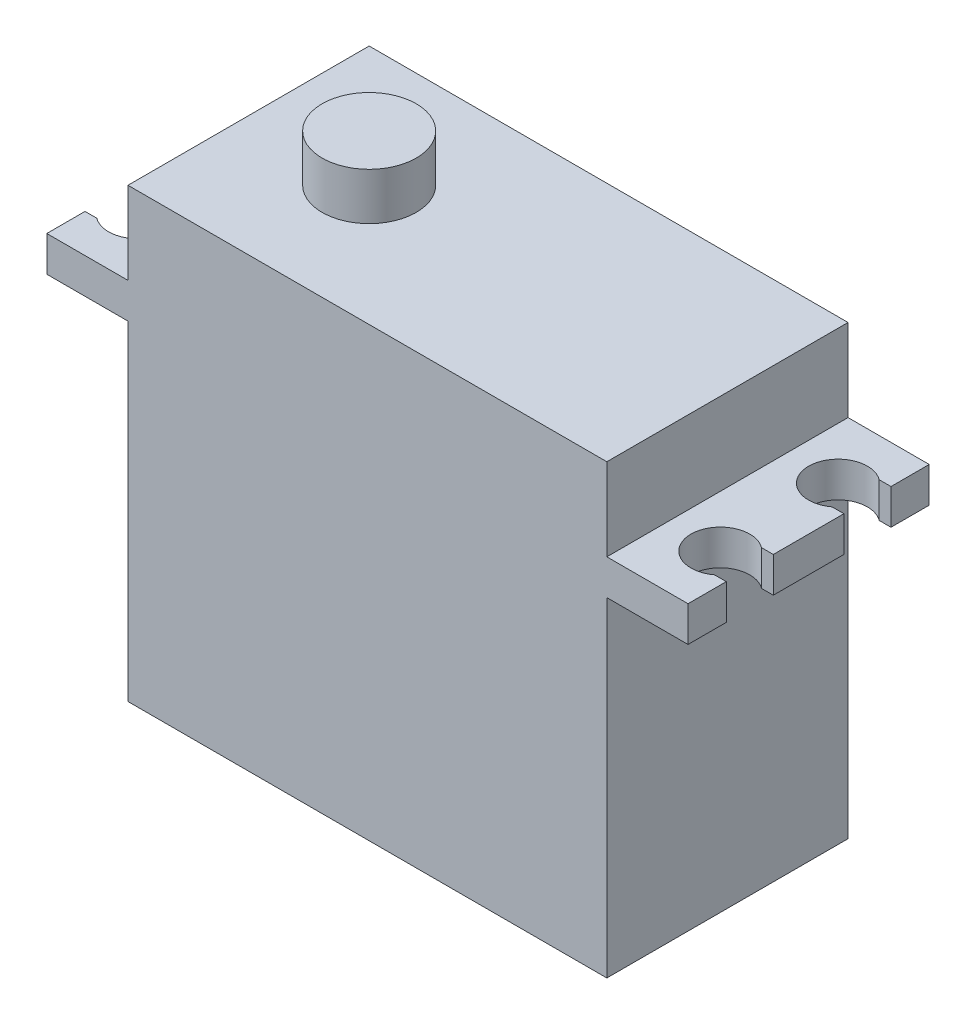
ISO-10303-21;
HEADER;
FILE_DESCRIPTION(('STEP AP214'),'2;1');
FILE_NAME('part.step','',(''),(''),'','','');
FILE_SCHEMA(('AUTOMOTIVE_DESIGN { 1 0 10303 214 1 1 1 1 }'));
ENDSEC;
DATA;
#1=APPLICATION_CONTEXT('core data for automotive mechanical design processes');
#2=APPLICATION_PROTOCOL_DEFINITION('international standard','automotive_design',2000,#1);
#3=PRODUCT_CONTEXT('',#1,'mechanical');
#4=PRODUCT('Part','Part','',(#3));
#5=PRODUCT_RELATED_PRODUCT_CATEGORY('part','',(#4));
#6=PRODUCT_DEFINITION_FORMATION('','',#4);
#7=PRODUCT_DEFINITION_CONTEXT('part definition',#1,'design');
#8=PRODUCT_DEFINITION('design','',#6,#7);
#9=PRODUCT_DEFINITION_SHAPE('','',#8);
#10=(LENGTH_UNIT() NAMED_UNIT(*) SI_UNIT(.MILLI.,.METRE.));
#11=(NAMED_UNIT(*) PLANE_ANGLE_UNIT() SI_UNIT($,.RADIAN.));
#12=(NAMED_UNIT(*) SI_UNIT($,.STERADIAN.) SOLID_ANGLE_UNIT());
#13=UNCERTAINTY_MEASURE_WITH_UNIT(LENGTH_MEASURE(1.E-05),#10,'distance_accuracy_value','');
#14=(GEOMETRIC_REPRESENTATION_CONTEXT(3) GLOBAL_UNCERTAINTY_ASSIGNED_CONTEXT((#13)) GLOBAL_UNIT_ASSIGNED_CONTEXT((#10,
#11,#12)) REPRESENTATION_CONTEXT('',''));
#15=CARTESIAN_POINT('',(0.,0.,0.));
#16=DIRECTION('',(0.,0.,1.));
#17=DIRECTION('',(1.,0.,0.));
#18=AXIS2_PLACEMENT_3D('',#15,#16,#17);
#19=CARTESIAN_POINT('',(47.6,31.,-20.5));
#20=DIRECTION('',(-1.,0.,0.));
#21=DIRECTION('',(0.,0.,1.));
#22=AXIS2_PLACEMENT_3D('',#19,#20,#21);
#23=PLANE('',#22);
#24=DIRECTION('',(0.,0.,-1.));
#25=VECTOR('',#24,1.);
#26=CARTESIAN_POINT('',(47.6,28.,-20.5));
#27=LINE('',#26,#25);
#28=CARTESIAN_POINT('',(47.6,28.,-7.25000000000004));
#29=VERTEX_POINT('',#28);
#30=CARTESIAN_POINT('',(47.6,28.,-13.25));
#31=VERTEX_POINT('',#30);
#32=EDGE_CURVE('E236',#29,#31,#27,.T.);
#33=ORIENTED_EDGE('',*,*,#32,.T.);
#34=DIRECTION('',(0.,-1.,0.));
#35=VECTOR('',#34,1.);
#36=CARTESIAN_POINT('',(47.6,42.,-13.25));
#37=LINE('',#36,#35);
#38=CARTESIAN_POINT('',(47.6,31.,-13.25));
#39=VERTEX_POINT('',#38);
#40=EDGE_CURVE('E220',#39,#31,#37,.T.);
#41=ORIENTED_EDGE('',*,*,#40,.F.);
#42=DIRECTION('',(0.,0.,-1.));
#43=VECTOR('',#42,1.);
#44=CARTESIAN_POINT('',(47.6,31.,-20.5));
#45=LINE('',#44,#43);
#46=CARTESIAN_POINT('',(47.6,31.,-7.25000000000004));
#47=VERTEX_POINT('',#46);
#48=EDGE_CURVE('E368',#47,#39,#45,.T.);
#49=ORIENTED_EDGE('',*,*,#48,.F.);
#50=DIRECTION('',(0.,-1.,0.));
#51=VECTOR('',#50,1.);
#52=CARTESIAN_POINT('',(47.6,42.,-7.25000000000004));
#53=LINE('',#52,#51);
#54=EDGE_CURVE('E243',#47,#29,#53,.T.);
#55=ORIENTED_EDGE('',*,*,#54,.T.);
#56=EDGE_LOOP('',(#33,#41,#49,#55));
#57=FACE_BOUND('',#56,.T.);
#58=ADVANCED_FACE('F35',(#57),#23,.F.);
#59=CARTESIAN_POINT('',(47.6,31.,-17.25));
#60=VERTEX_POINT('',#59);
#61=CARTESIAN_POINT('',(47.6,31.,-20.5));
#62=VERTEX_POINT('',#61);
#63=EDGE_CURVE('E365',#60,#62,#45,.T.);
#64=ORIENTED_EDGE('',*,*,#63,.F.);
#65=DIRECTION('',(0.,-1.,0.));
#66=VECTOR('',#65,1.);
#67=CARTESIAN_POINT('',(47.6,42.,-17.25));
#68=LINE('',#67,#66);
#69=CARTESIAN_POINT('',(47.6,28.,-17.25));
#70=VERTEX_POINT('',#69);
#71=EDGE_CURVE('E229',#60,#70,#68,.T.);
#72=ORIENTED_EDGE('',*,*,#71,.T.);
#73=CARTESIAN_POINT('',(47.6,28.,-20.5));
#74=VERTEX_POINT('',#73);
#75=EDGE_CURVE('E245',#70,#74,#27,.T.);
#76=ORIENTED_EDGE('',*,*,#75,.T.);
#77=DIRECTION('',(0.,-1.,0.));
#78=VECTOR('',#77,1.);
#79=CARTESIAN_POINT('',(47.6,31.,-20.5));
#80=LINE('',#79,#78);
#81=EDGE_CURVE('E260',#62,#74,#80,.T.);
#82=ORIENTED_EDGE('',*,*,#81,.F.);
#83=EDGE_LOOP('',(#64,#72,#76,#82));
#84=FACE_BOUND('',#83,.T.);
#85=ADVANCED_FACE('F460',(#84),#23,.F.);
#86=DIRECTION('',(0.,-1.,0.));
#87=VECTOR('',#86,1.);
#88=CARTESIAN_POINT('',(47.6,42.,-3.25000000000004));
#89=LINE('',#88,#87);
#90=CARTESIAN_POINT('',(47.6,31.,-3.25000000000004));
#91=VERTEX_POINT('',#90);
#92=CARTESIAN_POINT('',(47.6,28.,-3.25000000000004));
#93=VERTEX_POINT('',#92);
#94=EDGE_CURVE('E58',#91,#93,#89,.T.);
#95=ORIENTED_EDGE('',*,*,#94,.F.);
#96=CARTESIAN_POINT('',(47.6,31.,0.));
#97=VERTEX_POINT('',#96);
#98=EDGE_CURVE('E370',#97,#91,#45,.T.);
#99=ORIENTED_EDGE('',*,*,#98,.F.);
#100=DIRECTION('',(0.,-1.,0.));
#101=VECTOR('',#100,1.);
#102=CARTESIAN_POINT('',(47.6,31.,0.));
#103=LINE('',#102,#101);
#104=CARTESIAN_POINT('',(47.6,28.,0.));
#105=VERTEX_POINT('',#104);
#106=EDGE_CURVE('E264',#97,#105,#103,.T.);
#107=ORIENTED_EDGE('',*,*,#106,.T.);
#108=EDGE_CURVE('E244',#105,#93,#27,.T.);
#109=ORIENTED_EDGE('',*,*,#108,.T.);
#110=EDGE_LOOP('',(#95,#99,#107,#109));
#111=FACE_BOUND('',#110,.T.);
#112=ADVANCED_FACE('F462',(#111),#23,.F.);
#113=CARTESIAN_POINT('',(0.,31.,0.));
#114=DIRECTION('',(0.,1.,0.));
#115=DIRECTION('',(0.,0.,1.));
#116=AXIS2_PLACEMENT_3D('',#113,#114,#115);
#117=PLANE('',#116);
#118=DIRECTION('',(1.,0.,0.));
#119=VECTOR('',#118,1.);
#120=CARTESIAN_POINT('',(0.,31.,-13.25));
#121=LINE('',#120,#119);
#122=CARTESIAN_POINT('',(46.6,31.,-13.25));
#123=VERTEX_POINT('',#122);
#124=EDGE_CURVE('E223',#123,#39,#121,.T.);
#125=ORIENTED_EDGE('',*,*,#124,.F.);
#126=CARTESIAN_POINT('',(45.1,31.,-15.25));
#127=DIRECTION('',(0.,1.,0.));
#128=DIRECTION('',(0.,0.,1.));
#129=AXIS2_PLACEMENT_3D('',#126,#127,#128);
#130=CIRCLE('',#129,2.5);
#131=CARTESIAN_POINT('',(46.6,31.,-17.25));
#132=VERTEX_POINT('',#131);
#133=EDGE_CURVE('E228',#132,#123,#130,.T.);
#134=ORIENTED_EDGE('',*,*,#133,.F.);
#135=DIRECTION('',(-1.,0.,0.));
#136=VECTOR('',#135,1.);
#137=CARTESIAN_POINT('',(0.,31.,-17.25));
#138=LINE('',#137,#136);
#139=EDGE_CURVE('E518',#60,#132,#138,.T.);
#140=ORIENTED_EDGE('',*,*,#139,.F.);
#141=ORIENTED_EDGE('',*,*,#63,.T.);
#142=DIRECTION('',(-1.,0.,0.));
#143=VECTOR('',#142,1.);
#144=CARTESIAN_POINT('',(-6.90000000000001,31.,-20.5));
#145=LINE('',#144,#143);
#146=CARTESIAN_POINT('',(40.7,31.,-20.5));
#147=VERTEX_POINT('',#146);
#148=EDGE_CURVE('E261',#62,#147,#145,.T.);
#149=ORIENTED_EDGE('',*,*,#148,.T.);
#150=DIRECTION('',(0.,0.,-1.));
#151=VECTOR('',#150,1.);
#152=CARTESIAN_POINT('',(40.7,31.,0.));
#153=LINE('',#152,#151);
#154=CARTESIAN_POINT('',(40.7,31.,0.));
#155=VERTEX_POINT('',#154);
#156=EDGE_CURVE('E276',#155,#147,#153,.T.);
#157=ORIENTED_EDGE('',*,*,#156,.F.);
#158=DIRECTION('',(1.,0.,0.));
#159=VECTOR('',#158,1.);
#160=CARTESIAN_POINT('',(-6.9,31.,0.));
#161=LINE('',#160,#159);
#162=EDGE_CURVE('E366',#155,#97,#161,.T.);
#163=ORIENTED_EDGE('',*,*,#162,.T.);
#164=ORIENTED_EDGE('',*,*,#98,.T.);
#165=DIRECTION('',(-1.,0.,0.));
#166=VECTOR('',#165,1.);
#167=CARTESIAN_POINT('',(0.,31.,-3.24999999999997));
#168=LINE('',#167,#166);
#169=CARTESIAN_POINT('',(46.6,31.,-3.25000000000003));
#170=VERTEX_POINT('',#169);
#171=EDGE_CURVE('E482',#91,#170,#168,.T.);
#172=ORIENTED_EDGE('',*,*,#171,.T.);
#173=CARTESIAN_POINT('',(45.1,31.,-5.25000000000003));
#174=DIRECTION('',(0.,1.,0.));
#175=DIRECTION('',(0.,0.,1.));
#176=AXIS2_PLACEMENT_3D('',#173,#174,#175);
#177=CIRCLE('',#176,2.5);
#178=CARTESIAN_POINT('',(46.6,31.,-7.25000000000004));
#179=VERTEX_POINT('',#178);
#180=EDGE_CURVE('E442',#170,#179,#177,.F.);
#181=ORIENTED_EDGE('',*,*,#180,.T.);
#182=DIRECTION('',(1.,0.,0.));
#183=VECTOR('',#182,1.);
#184=CARTESIAN_POINT('',(0.,31.,-7.24999999999997));
#185=LINE('',#184,#183);
#186=EDGE_CURVE('E438',#179,#47,#185,.T.);
#187=ORIENTED_EDGE('',*,*,#186,.T.);
#188=ORIENTED_EDGE('',*,*,#48,.T.);
#189=EDGE_LOOP('',(#125,#134,#140,#141,#149,#157,#163,#164,#172,#181,#187,#188));
#190=FACE_BOUND('',#189,.T.);
#191=ADVANCED_FACE('F470',(#190),#117,.T.);
#192=CARTESIAN_POINT('',(0.,28.,0.));
#193=DIRECTION('',(0.,1.,0.));
#194=DIRECTION('',(0.,0.,1.));
#195=AXIS2_PLACEMENT_3D('',#192,#193,#194);
#196=PLANE('',#195);
#197=CARTESIAN_POINT('',(45.1,28.,-15.25));
#198=DIRECTION('',(0.,-1.,0.));
#199=DIRECTION('',(0.,0.,1.));
#200=AXIS2_PLACEMENT_3D('',#197,#198,#199);
#201=CIRCLE('',#200,2.5);
#202=CARTESIAN_POINT('',(46.6,28.,-13.25));
#203=VERTEX_POINT('',#202);
#204=CARTESIAN_POINT('',(46.6,28.,-17.25));
#205=VERTEX_POINT('',#204);
#206=EDGE_CURVE('E239',#203,#205,#201,.T.);
#207=ORIENTED_EDGE('',*,*,#206,.F.);
#208=DIRECTION('',(-1.,0.,0.));
#209=VECTOR('',#208,1.);
#210=CARTESIAN_POINT('',(47.6,28.,-13.25));
#211=LINE('',#210,#209);
#212=EDGE_CURVE('E50',#31,#203,#211,.T.);
#213=ORIENTED_EDGE('',*,*,#212,.F.);
#214=ORIENTED_EDGE('',*,*,#32,.F.);
#215=DIRECTION('',(-1.,0.,0.));
#216=VECTOR('',#215,1.);
#217=CARTESIAN_POINT('',(47.6,28.,-7.25000000000004));
#218=LINE('',#217,#216);
#219=CARTESIAN_POINT('',(46.6,28.,-7.25000000000004));
#220=VERTEX_POINT('',#219);
#221=EDGE_CURVE('E492',#29,#220,#218,.T.);
#222=ORIENTED_EDGE('',*,*,#221,.T.);
#223=CARTESIAN_POINT('',(45.1,28.,-5.25000000000003));
#224=DIRECTION('',(0.,1.,0.));
#225=DIRECTION('',(0.,0.,-1.));
#226=AXIS2_PLACEMENT_3D('',#223,#224,#225);
#227=CIRCLE('',#226,2.5);
#228=CARTESIAN_POINT('',(46.6,28.,-3.25000000000003));
#229=VERTEX_POINT('',#228);
#230=EDGE_CURVE('E488',#220,#229,#227,.T.);
#231=ORIENTED_EDGE('',*,*,#230,.T.);
#232=DIRECTION('',(1.,0.,0.));
#233=VECTOR('',#232,1.);
#234=CARTESIAN_POINT('',(46.6,28.,-3.25000000000003));
#235=LINE('',#234,#233);
#236=EDGE_CURVE('E486',#229,#93,#235,.T.);
#237=ORIENTED_EDGE('',*,*,#236,.T.);
#238=ORIENTED_EDGE('',*,*,#108,.F.);
#239=DIRECTION('',(1.,0.,0.));
#240=VECTOR('',#239,1.);
#241=CARTESIAN_POINT('',(-6.9,28.,0.));
#242=LINE('',#241,#240);
#243=CARTESIAN_POINT('',(40.7,28.,0.));
#244=VERTEX_POINT('',#243);
#245=EDGE_CURVE('E349',#244,#105,#242,.T.);
#246=ORIENTED_EDGE('',*,*,#245,.F.);
#247=DIRECTION('',(0.,0.,-1.));
#248=VECTOR('',#247,1.);
#249=CARTESIAN_POINT('',(40.7,28.,0.));
#250=LINE('',#249,#248);
#251=CARTESIAN_POINT('',(40.7,28.,-20.5));
#252=VERTEX_POINT('',#251);
#253=EDGE_CURVE('E270',#244,#252,#250,.T.);
#254=ORIENTED_EDGE('',*,*,#253,.T.);
#255=DIRECTION('',(-1.,0.,0.));
#256=VECTOR('',#255,1.);
#257=CARTESIAN_POINT('',(-6.90000000000001,28.,-20.5));
#258=LINE('',#257,#256);
#259=EDGE_CURVE('E253',#74,#252,#258,.T.);
#260=ORIENTED_EDGE('',*,*,#259,.F.);
#261=ORIENTED_EDGE('',*,*,#75,.F.);
#262=DIRECTION('',(1.,0.,0.));
#263=VECTOR('',#262,1.);
#264=CARTESIAN_POINT('',(46.6,28.,-17.25));
#265=LINE('',#264,#263);
#266=EDGE_CURVE('E240',#205,#70,#265,.T.);
#267=ORIENTED_EDGE('',*,*,#266,.F.);
#268=EDGE_LOOP('',(#207,#213,#214,#222,#231,#237,#238,#246,#254,#260,#261,#267));
#269=FACE_BOUND('',#268,.T.);
#270=ADVANCED_FACE('F234',(#269),#196,.F.);
#271=CARTESIAN_POINT('',(-6.90000000000001,31.,-20.5));
#272=DIRECTION('',(1.,0.,0.));
#273=DIRECTION('',(0.,0.,-1.));
#274=AXIS2_PLACEMENT_3D('',#271,#272,#273);
#275=PLANE('',#274);
#276=DIRECTION('',(0.,0.,1.));
#277=VECTOR('',#276,1.);
#278=CARTESIAN_POINT('',(-6.90000000000001,28.,-20.5));
#279=LINE('',#278,#277);
#280=CARTESIAN_POINT('',(-6.90000000000001,28.,-13.25));
#281=VERTEX_POINT('',#280);
#282=CARTESIAN_POINT('',(-6.90000000000001,28.,-7.25));
#283=VERTEX_POINT('',#282);
#284=EDGE_CURVE('E340',#281,#283,#279,.T.);
#285=ORIENTED_EDGE('',*,*,#284,.T.);
#286=DIRECTION('',(0.,1.,0.));
#287=VECTOR('',#286,1.);
#288=CARTESIAN_POINT('',(-6.90000000000001,31.,-7.25));
#289=LINE('',#288,#287);
#290=CARTESIAN_POINT('',(-6.90000000000001,31.,-7.25));
#291=VERTEX_POINT('',#290);
#292=EDGE_CURVE('E12',#283,#291,#289,.T.);
#293=ORIENTED_EDGE('',*,*,#292,.T.);
#294=DIRECTION('',(0.,0.,1.));
#295=VECTOR('',#294,1.);
#296=CARTESIAN_POINT('',(-6.90000000000001,31.,-20.5));
#297=LINE('',#296,#295);
#298=CARTESIAN_POINT('',(-6.90000000000001,31.,-13.25));
#299=VERTEX_POINT('',#298);
#300=EDGE_CURVE('E392',#299,#291,#297,.T.);
#301=ORIENTED_EDGE('',*,*,#300,.F.);
#302=DIRECTION('',(0.,1.,0.));
#303=VECTOR('',#302,1.);
#304=CARTESIAN_POINT('',(-6.90000000000001,31.,-13.25));
#305=LINE('',#304,#303);
#306=EDGE_CURVE('E323',#281,#299,#305,.T.);
#307=ORIENTED_EDGE('',*,*,#306,.F.);
#308=EDGE_LOOP('',(#285,#293,#301,#307));
#309=FACE_BOUND('',#308,.T.);
#310=ADVANCED_FACE('F428',(#309),#275,.F.);
#311=DIRECTION('',(-1.,0.,0.));
#312=VECTOR('',#311,1.);
#313=CARTESIAN_POINT('',(0.,31.,-7.25));
#314=LINE('',#313,#312);
#315=CARTESIAN_POINT('',(-5.90000000000002,31.,-7.25));
#316=VERTEX_POINT('',#315);
#317=EDGE_CURVE('E398',#316,#291,#314,.T.);
#318=ORIENTED_EDGE('',*,*,#317,.F.);
#319=CARTESIAN_POINT('',(-4.40000000000001,31.,-5.25));
#320=DIRECTION('',(0.,1.,0.));
#321=DIRECTION('',(0.,0.,1.));
#322=AXIS2_PLACEMENT_3D('',#319,#320,#321);
#323=CIRCLE('',#322,2.5);
#324=CARTESIAN_POINT('',(-5.90000000000001,31.,-3.25));
#325=VERTEX_POINT('',#324);
#326=EDGE_CURVE('E396',#325,#316,#323,.T.);
#327=ORIENTED_EDGE('',*,*,#326,.F.);
#328=DIRECTION('',(1.,0.,0.));
#329=VECTOR('',#328,1.);
#330=CARTESIAN_POINT('',(0.,31.,-3.25));
#331=LINE('',#330,#329);
#332=CARTESIAN_POINT('',(-6.90000000000001,31.,-3.25));
#333=VERTEX_POINT('',#332);
#334=EDGE_CURVE('E395',#333,#325,#331,.T.);
#335=ORIENTED_EDGE('',*,*,#334,.F.);
#336=CARTESIAN_POINT('',(-6.9,31.,0.));
#337=VERTEX_POINT('',#336);
#338=EDGE_CURVE('E256',#333,#337,#297,.T.);
#339=ORIENTED_EDGE('',*,*,#338,.T.);
#340=CARTESIAN_POINT('',(0.,31.,0.));
#341=VERTEX_POINT('',#340);
#342=EDGE_CURVE('E361',#337,#341,#161,.T.);
#343=ORIENTED_EDGE('',*,*,#342,.T.);
#344=DIRECTION('',(0.,0.,1.));
#345=VECTOR('',#344,1.);
#346=CARTESIAN_POINT('',(0.,31.,0.));
#347=LINE('',#346,#345);
#348=CARTESIAN_POINT('',(0.,31.,-20.5));
#349=VERTEX_POINT('',#348);
#350=EDGE_CURVE('E278',#349,#341,#347,.T.);
#351=ORIENTED_EDGE('',*,*,#350,.F.);
#352=CARTESIAN_POINT('',(-6.90000000000001,31.,-20.5));
#353=VERTEX_POINT('',#352);
#354=EDGE_CURVE('E374',#349,#353,#145,.T.);
#355=ORIENTED_EDGE('',*,*,#354,.T.);
#356=CARTESIAN_POINT('',(-6.90000000000001,31.,-17.25));
#357=VERTEX_POINT('',#356);
#358=EDGE_CURVE('E371',#353,#357,#297,.T.);
#359=ORIENTED_EDGE('',*,*,#358,.T.);
#360=DIRECTION('',(1.,0.,0.));
#361=VECTOR('',#360,1.);
#362=CARTESIAN_POINT('',(0.,31.,-17.25));
#363=LINE('',#362,#361);
#364=CARTESIAN_POINT('',(-5.90000000000001,31.,-17.25));
#365=VERTEX_POINT('',#364);
#366=EDGE_CURVE('E420',#357,#365,#363,.T.);
#367=ORIENTED_EDGE('',*,*,#366,.T.);
#368=CARTESIAN_POINT('',(-4.40000000000001,31.,-15.25));
#369=DIRECTION('',(0.,1.,0.));
#370=DIRECTION('',(0.,0.,1.));
#371=AXIS2_PLACEMENT_3D('',#368,#369,#370);
#372=CIRCLE('',#371,2.5);
#373=CARTESIAN_POINT('',(-5.90000000000002,31.,-13.25));
#374=VERTEX_POINT('',#373);
#375=EDGE_CURVE('E341',#365,#374,#372,.F.);
#376=ORIENTED_EDGE('',*,*,#375,.T.);
#377=DIRECTION('',(-1.,0.,0.));
#378=VECTOR('',#377,1.);
#379=CARTESIAN_POINT('',(0.,31.,-13.25));
#380=LINE('',#379,#378);
#381=EDGE_CURVE('E345',#374,#299,#380,.T.);
#382=ORIENTED_EDGE('',*,*,#381,.T.);
#383=ORIENTED_EDGE('',*,*,#300,.T.);
#384=EDGE_LOOP('',(#318,#327,#335,#339,#343,#351,#355,#359,#367,#376,#382,#383));
#385=FACE_BOUND('',#384,.T.);
#386=ADVANCED_FACE('F383',(#385),#117,.T.);
#387=CARTESIAN_POINT('',(-4.40000000000001,28.,-5.25));
#388=DIRECTION('',(0.,-1.,0.));
#389=DIRECTION('',(0.,0.,-1.));
#390=AXIS2_PLACEMENT_3D('',#387,#388,#389);
#391=CIRCLE('',#390,2.5);
#392=CARTESIAN_POINT('',(-5.90000000000002,28.,-7.25));
#393=VERTEX_POINT('',#392);
#394=CARTESIAN_POINT('',(-5.90000000000001,28.,-3.25));
#395=VERTEX_POINT('',#394);
#396=EDGE_CURVE('E437',#393,#395,#391,.T.);
#397=ORIENTED_EDGE('',*,*,#396,.F.);
#398=DIRECTION('',(1.,0.,0.));
#399=VECTOR('',#398,1.);
#400=CARTESIAN_POINT('',(-6.90000000000001,28.,-7.25));
#401=LINE('',#400,#399);
#402=EDGE_CURVE('E435',#283,#393,#401,.T.);
#403=ORIENTED_EDGE('',*,*,#402,.F.);
#404=ORIENTED_EDGE('',*,*,#284,.F.);
#405=DIRECTION('',(1.,0.,0.));
#406=VECTOR('',#405,1.);
#407=CARTESIAN_POINT('',(-6.90000000000001,28.,-13.25));
#408=LINE('',#407,#406);
#409=CARTESIAN_POINT('',(-5.90000000000002,28.,-13.25));
#410=VERTEX_POINT('',#409);
#411=EDGE_CURVE('E407',#281,#410,#408,.T.);
#412=ORIENTED_EDGE('',*,*,#411,.T.);
#413=CARTESIAN_POINT('',(-4.40000000000001,28.,-15.25));
#414=DIRECTION('',(0.,1.,0.));
#415=DIRECTION('',(0.,0.,1.));
#416=AXIS2_PLACEMENT_3D('',#413,#414,#415);
#417=CIRCLE('',#416,2.5);
#418=CARTESIAN_POINT('',(-5.90000000000001,28.,-17.25));
#419=VERTEX_POINT('',#418);
#420=EDGE_CURVE('E410',#410,#419,#417,.T.);
#421=ORIENTED_EDGE('',*,*,#420,.T.);
#422=DIRECTION('',(-1.,0.,0.));
#423=VECTOR('',#422,1.);
#424=CARTESIAN_POINT('',(-5.90000000000001,28.,-17.25));
#425=LINE('',#424,#423);
#426=CARTESIAN_POINT('',(-6.90000000000001,28.,-17.25));
#427=VERTEX_POINT('',#426);
#428=EDGE_CURVE('E413',#419,#427,#425,.T.);
#429=ORIENTED_EDGE('',*,*,#428,.T.);
#430=CARTESIAN_POINT('',(-6.90000000000001,28.,-20.5));
#431=VERTEX_POINT('',#430);
#432=EDGE_CURVE('E342',#431,#427,#279,.T.);
#433=ORIENTED_EDGE('',*,*,#432,.F.);
#434=CARTESIAN_POINT('',(0.,28.,-20.5));
#435=VERTEX_POINT('',#434);
#436=EDGE_CURVE('E248',#435,#431,#258,.T.);
#437=ORIENTED_EDGE('',*,*,#436,.F.);
#438=DIRECTION('',(0.,0.,1.));
#439=VECTOR('',#438,1.);
#440=CARTESIAN_POINT('',(0.,28.,0.));
#441=LINE('',#440,#439);
#442=CARTESIAN_POINT('',(0.,28.,0.));
#443=VERTEX_POINT('',#442);
#444=EDGE_CURVE('E273',#435,#443,#441,.T.);
#445=ORIENTED_EDGE('',*,*,#444,.T.);
#446=CARTESIAN_POINT('',(-6.9,28.,0.));
#447=VERTEX_POINT('',#446);
#448=EDGE_CURVE('E249',#447,#443,#242,.T.);
#449=ORIENTED_EDGE('',*,*,#448,.F.);
#450=CARTESIAN_POINT('',(-6.90000000000001,28.,-3.25));
#451=VERTEX_POINT('',#450);
#452=EDGE_CURVE('E330',#451,#447,#279,.T.);
#453=ORIENTED_EDGE('',*,*,#452,.F.);
#454=DIRECTION('',(-1.,0.,0.));
#455=VECTOR('',#454,1.);
#456=CARTESIAN_POINT('',(-5.90000000000001,28.,-3.25));
#457=LINE('',#456,#455);
#458=EDGE_CURVE('E338',#395,#451,#457,.T.);
#459=ORIENTED_EDGE('',*,*,#458,.F.);
#460=EDGE_LOOP('',(#397,#403,#404,#412,#421,#429,#433,#437,#445,#449,#453,#459));
#461=FACE_BOUND('',#460,.T.);
#462=ADVANCED_FACE('F337',(#461),#196,.F.);
#463=ORIENTED_EDGE('',*,*,#338,.F.);
#464=DIRECTION('',(0.,-1.,0.));
#465=VECTOR('',#464,1.);
#466=CARTESIAN_POINT('',(-6.90000000000001,31.,-3.25));
#467=LINE('',#466,#465);
#468=EDGE_CURVE('E43',#333,#451,#467,.T.);
#469=ORIENTED_EDGE('',*,*,#468,.T.);
#470=ORIENTED_EDGE('',*,*,#452,.T.);
#471=DIRECTION('',(0.,-1.,0.));
#472=VECTOR('',#471,1.);
#473=CARTESIAN_POINT('',(-6.9,31.,0.));
#474=LINE('',#473,#472);
#475=EDGE_CURVE('E267',#337,#447,#474,.T.);
#476=ORIENTED_EDGE('',*,*,#475,.F.);
#477=EDGE_LOOP('',(#463,#469,#470,#476));
#478=FACE_BOUND('',#477,.T.);
#479=ADVANCED_FACE('F328',(#478),#275,.F.);
#480=DIRECTION('',(0.,-1.,0.));
#481=VECTOR('',#480,1.);
#482=CARTESIAN_POINT('',(-6.90000000000001,31.,-17.25));
#483=LINE('',#482,#481);
#484=EDGE_CURVE('E321',#357,#427,#483,.T.);
#485=ORIENTED_EDGE('',*,*,#484,.F.);
#486=ORIENTED_EDGE('',*,*,#358,.F.);
#487=DIRECTION('',(0.,-1.,0.));
#488=VECTOR('',#487,1.);
#489=CARTESIAN_POINT('',(-6.90000000000001,31.,-20.5));
#490=LINE('',#489,#488);
#491=EDGE_CURVE('E257',#353,#431,#490,.T.);
#492=ORIENTED_EDGE('',*,*,#491,.T.);
#493=ORIENTED_EDGE('',*,*,#432,.T.);
#494=EDGE_LOOP('',(#485,#486,#492,#493));
#495=FACE_BOUND('',#494,.T.);
#496=ADVANCED_FACE('F391',(#495),#275,.F.);
#497=CARTESIAN_POINT('',(0.,38.,0.));
#498=DIRECTION('',(1.,0.,0.));
#499=DIRECTION('',(0.,0.,-1.));
#500=AXIS2_PLACEMENT_3D('',#497,#498,#499);
#501=PLANE('',#500);
#502=ORIENTED_EDGE('',*,*,#444,.F.);
#503=DIRECTION('',(0.,-1.,0.));
#504=VECTOR('',#503,1.);
#505=CARTESIAN_POINT('',(0.,38.,-20.5));
#506=LINE('',#505,#504);
#507=CARTESIAN_POINT('',(0.,0.,-20.5));
#508=VERTEX_POINT('',#507);
#509=EDGE_CURVE('E294',#435,#508,#506,.T.);
#510=ORIENTED_EDGE('',*,*,#509,.T.);
#511=DIRECTION('',(0.,0.,1.));
#512=VECTOR('',#511,1.);
#513=CARTESIAN_POINT('',(0.,0.,0.));
#514=LINE('',#513,#512);
#515=CARTESIAN_POINT('',(0.,0.,0.));
#516=VERTEX_POINT('',#515);
#517=EDGE_CURVE('E283',#508,#516,#514,.T.);
#518=ORIENTED_EDGE('',*,*,#517,.T.);
#519=DIRECTION('',(0.,-1.,0.));
#520=VECTOR('',#519,1.);
#521=CARTESIAN_POINT('',(0.,38.,0.));
#522=LINE('',#521,#520);
#523=EDGE_CURVE('E314',#443,#516,#522,.T.);
#524=ORIENTED_EDGE('',*,*,#523,.F.);
#525=EDGE_LOOP('',(#502,#510,#518,#524));
#526=FACE_BOUND('',#525,.T.);
#527=ADVANCED_FACE('F548',(#526),#501,.F.);
#528=CARTESIAN_POINT('',(40.7,38.,0.));
#529=DIRECTION('',(-1.,0.,0.));
#530=DIRECTION('',(0.,0.,1.));
#531=AXIS2_PLACEMENT_3D('',#528,#529,#530);
#532=PLANE('',#531);
#533=ORIENTED_EDGE('',*,*,#253,.F.);
#534=DIRECTION('',(0.,-1.,0.));
#535=VECTOR('',#534,1.);
#536=CARTESIAN_POINT('',(40.7,38.,0.));
#537=LINE('',#536,#535);
#538=CARTESIAN_POINT('',(40.7,0.,0.));
#539=VERTEX_POINT('',#538);
#540=EDGE_CURVE('E311',#244,#539,#537,.T.);
#541=ORIENTED_EDGE('',*,*,#540,.T.);
#542=DIRECTION('',(0.,0.,-1.));
#543=VECTOR('',#542,1.);
#544=CARTESIAN_POINT('',(40.7,0.,0.));
#545=LINE('',#544,#543);
#546=CARTESIAN_POINT('',(40.7,0.,-20.5));
#547=VERTEX_POINT('',#546);
#548=EDGE_CURVE('E300',#539,#547,#545,.T.);
#549=ORIENTED_EDGE('',*,*,#548,.T.);
#550=DIRECTION('',(0.,-1.,0.));
#551=VECTOR('',#550,1.);
#552=CARTESIAN_POINT('',(40.7,38.,-20.5));
#553=LINE('',#552,#551);
#554=EDGE_CURVE('E307',#252,#547,#553,.T.);
#555=ORIENTED_EDGE('',*,*,#554,.F.);
#556=EDGE_LOOP('',(#533,#541,#549,#555));
#557=FACE_BOUND('',#556,.T.);
#558=ADVANCED_FACE('F547',(#557),#532,.F.);
#559=CARTESIAN_POINT('',(0.,38.,-20.5));
#560=VERTEX_POINT('',#559);
#561=EDGE_CURVE('E305',#560,#349,#506,.T.);
#562=ORIENTED_EDGE('',*,*,#561,.T.);
#563=ORIENTED_EDGE('',*,*,#350,.T.);
#564=CARTESIAN_POINT('',(0.,38.,0.));
#565=VERTEX_POINT('',#564);
#566=EDGE_CURVE('E315',#565,#341,#522,.T.);
#567=ORIENTED_EDGE('',*,*,#566,.F.);
#568=DIRECTION('',(0.,0.,1.));
#569=VECTOR('',#568,1.);
#570=CARTESIAN_POINT('',(0.,38.,0.));
#571=LINE('',#570,#569);
#572=EDGE_CURVE('E284',#560,#565,#571,.T.);
#573=ORIENTED_EDGE('',*,*,#572,.F.);
#574=EDGE_LOOP('',(#562,#563,#567,#573));
#575=FACE_BOUND('',#574,.T.);
#576=ADVANCED_FACE('F37',(#575),#501,.F.);
#577=CARTESIAN_POINT('',(0.,38.,0.));
#578=DIRECTION('',(0.,0.,-1.));
#579=DIRECTION('',(-1.,0.,0.));
#580=AXIS2_PLACEMENT_3D('',#577,#578,#579);
#581=PLANE('',#580);
#582=ORIENTED_EDGE('',*,*,#566,.T.);
#583=ORIENTED_EDGE('',*,*,#342,.F.);
#584=ORIENTED_EDGE('',*,*,#475,.T.);
#585=ORIENTED_EDGE('',*,*,#448,.T.);
#586=ORIENTED_EDGE('',*,*,#523,.T.);
#587=DIRECTION('',(1.,0.,0.));
#588=VECTOR('',#587,1.);
#589=CARTESIAN_POINT('',(0.,0.,0.));
#590=LINE('',#589,#588);
#591=EDGE_CURVE('E297',#516,#539,#590,.T.);
#592=ORIENTED_EDGE('',*,*,#591,.T.);
#593=ORIENTED_EDGE('',*,*,#540,.F.);
#594=ORIENTED_EDGE('',*,*,#245,.T.);
#595=ORIENTED_EDGE('',*,*,#106,.F.);
#596=ORIENTED_EDGE('',*,*,#162,.F.);
#597=CARTESIAN_POINT('',(40.7,38.,0.));
#598=VERTEX_POINT('',#597);
#599=EDGE_CURVE('E312',#598,#155,#537,.T.);
#600=ORIENTED_EDGE('',*,*,#599,.F.);
#601=DIRECTION('',(1.,0.,0.));
#602=VECTOR('',#601,1.);
#603=CARTESIAN_POINT('',(0.,38.,0.));
#604=LINE('',#603,#602);
#605=EDGE_CURVE('E287',#565,#598,#604,.T.);
#606=ORIENTED_EDGE('',*,*,#605,.F.);
#607=EDGE_LOOP('',(#582,#583,#584,#585,#586,#592,#593,#594,#595,#596,#600,#606));
#608=FACE_BOUND('',#607,.T.);
#609=ADVANCED_FACE('F357',(#608),#581,.F.);
#610=ORIENTED_EDGE('',*,*,#599,.T.);
#611=ORIENTED_EDGE('',*,*,#156,.T.);
#612=CARTESIAN_POINT('',(40.7,38.,-20.5));
#613=VERTEX_POINT('',#612);
#614=EDGE_CURVE('E308',#613,#147,#553,.T.);
#615=ORIENTED_EDGE('',*,*,#614,.F.);
#616=DIRECTION('',(0.,0.,-1.));
#617=VECTOR('',#616,1.);
#618=CARTESIAN_POINT('',(40.7,38.,0.));
#619=LINE('',#618,#617);
#620=EDGE_CURVE('E290',#598,#613,#619,.T.);
#621=ORIENTED_EDGE('',*,*,#620,.F.);
#622=EDGE_LOOP('',(#610,#611,#615,#621));
#623=FACE_BOUND('',#622,.T.);
#624=ADVANCED_FACE('F541',(#623),#532,.F.);
#625=CARTESIAN_POINT('',(0.,38.,-20.5));
#626=DIRECTION('',(0.,0.,1.));
#627=DIRECTION('',(1.,0.,0.));
#628=AXIS2_PLACEMENT_3D('',#625,#626,#627);
#629=PLANE('',#628);
#630=ORIENTED_EDGE('',*,*,#614,.T.);
#631=ORIENTED_EDGE('',*,*,#148,.F.);
#632=ORIENTED_EDGE('',*,*,#81,.T.);
#633=ORIENTED_EDGE('',*,*,#259,.T.);
#634=ORIENTED_EDGE('',*,*,#554,.T.);
#635=DIRECTION('',(-1.,0.,0.));
#636=VECTOR('',#635,1.);
#637=CARTESIAN_POINT('',(0.,0.,-20.5));
#638=LINE('',#637,#636);
#639=EDGE_CURVE('E288',#547,#508,#638,.T.);
#640=ORIENTED_EDGE('',*,*,#639,.T.);
#641=ORIENTED_EDGE('',*,*,#509,.F.);
#642=ORIENTED_EDGE('',*,*,#436,.T.);
#643=ORIENTED_EDGE('',*,*,#491,.F.);
#644=ORIENTED_EDGE('',*,*,#354,.F.);
#645=ORIENTED_EDGE('',*,*,#561,.F.);
#646=DIRECTION('',(-1.,0.,0.));
#647=VECTOR('',#646,1.);
#648=CARTESIAN_POINT('',(0.,38.,-20.5));
#649=LINE('',#648,#647);
#650=EDGE_CURVE('E292',#613,#560,#649,.T.);
#651=ORIENTED_EDGE('',*,*,#650,.F.);
#652=EDGE_LOOP('',(#630,#631,#632,#633,#634,#640,#641,#642,#643,#644,#645,#651));
#653=FACE_BOUND('',#652,.T.);
#654=ADVANCED_FACE('F388',(#653),#629,.F.);
#655=CARTESIAN_POINT('',(0.,38.,0.));
#656=DIRECTION('',(0.,-1.,0.));
#657=DIRECTION('',(0.,0.,-1.));
#658=AXIS2_PLACEMENT_3D('',#655,#656,#657);
#659=PLANE('',#658);
#660=CARTESIAN_POINT('',(10.25,38.,-10.25));
#661=DIRECTION('',(0.,-1.,0.));
#662=DIRECTION('',(0.,0.,-1.));
#663=AXIS2_PLACEMENT_3D('',#660,#661,#662);
#664=CIRCLE('',#663,4.);
#665=CARTESIAN_POINT('',(10.25,38.,-14.25));
#666=VERTEX_POINT('',#665);
#667=EDGE_CURVE('E318',#666,#666,#664,.F.);
#668=ORIENTED_EDGE('',*,*,#667,.F.);
#669=EDGE_LOOP('',(#668));
#670=FACE_BOUND('',#669,.T.);
#671=ORIENTED_EDGE('',*,*,#572,.T.);
#672=ORIENTED_EDGE('',*,*,#605,.T.);
#673=ORIENTED_EDGE('',*,*,#620,.T.);
#674=ORIENTED_EDGE('',*,*,#650,.T.);
#675=EDGE_LOOP('',(#671,#672,#673,#674));
#676=FACE_BOUND('',#675,.T.);
#677=ADVANCED_FACE('F544',(#670,#676),#659,.F.);
#678=CARTESIAN_POINT('',(0.,0.,0.));
#679=DIRECTION('',(0.,-1.,0.));
#680=DIRECTION('',(0.,0.,-1.));
#681=AXIS2_PLACEMENT_3D('',#678,#679,#680);
#682=PLANE('',#681);
#683=ORIENTED_EDGE('',*,*,#517,.F.);
#684=ORIENTED_EDGE('',*,*,#639,.F.);
#685=ORIENTED_EDGE('',*,*,#548,.F.);
#686=ORIENTED_EDGE('',*,*,#591,.F.);
#687=EDGE_LOOP('',(#683,#684,#685,#686));
#688=FACE_BOUND('',#687,.T.);
#689=ADVANCED_FACE('F595',(#688),#682,.T.);
#690=CARTESIAN_POINT('',(10.25,95.3137084989848,-10.25));
#691=DIRECTION('',(0.,-1.,0.));
#692=DIRECTION('',(0.,0.,-1.));
#693=AXIS2_PLACEMENT_3D('',#690,#691,#692);
#694=CYLINDRICAL_SURFACE('',#693,4.);
#695=CARTESIAN_POINT('',(10.25,42.,-10.25));
#696=DIRECTION('',(0.,-1.,0.));
#697=DIRECTION('',(0.,0.,-1.));
#698=AXIS2_PLACEMENT_3D('',#695,#696,#697);
#699=CIRCLE('',#698,4.);
#700=CARTESIAN_POINT('',(10.25,42.,-14.25));
#701=VERTEX_POINT('',#700);
#702=EDGE_CURVE('E280',#701,#701,#699,.T.);
#703=CARTESIAN_POINT('',(10.25,42.,-14.25));
#704=CARTESIAN_POINT('',(10.25,41.9583333333333,-14.25));
#705=CARTESIAN_POINT('',(10.25,41.9166666666667,-14.25));
#706=CARTESIAN_POINT('',(10.25,41.8333333333333,-14.25));
#707=CARTESIAN_POINT('',(10.25,41.7916666666667,-14.25));
#708=CARTESIAN_POINT('',(10.25,41.7083333333333,-14.25));
#709=CARTESIAN_POINT('',(10.25,41.6666666666667,-14.25));
#710=CARTESIAN_POINT('',(10.25,41.5833333333333,-14.25));
#711=CARTESIAN_POINT('',(10.25,41.5416666666667,-14.25));
#712=CARTESIAN_POINT('',(10.25,41.4583333333333,-14.25));
#713=CARTESIAN_POINT('',(10.25,41.4166666666667,-14.25));
#714=CARTESIAN_POINT('',(10.25,41.3333333333333,-14.25));
#715=CARTESIAN_POINT('',(10.25,41.2916666666667,-14.25));
#716=CARTESIAN_POINT('',(10.25,41.2083333333333,-14.25));
#717=CARTESIAN_POINT('',(10.25,41.1666666666667,-14.25));
#718=CARTESIAN_POINT('',(10.25,41.0833333333333,-14.25));
#719=CARTESIAN_POINT('',(10.25,41.0416666666667,-14.25));
#720=CARTESIAN_POINT('',(10.25,40.9583333333333,-14.25));
#721=CARTESIAN_POINT('',(10.25,40.9166666666667,-14.25));
#722=CARTESIAN_POINT('',(10.25,40.8333333333333,-14.25));
#723=CARTESIAN_POINT('',(10.25,40.7916666666667,-14.25));
#724=CARTESIAN_POINT('',(10.25,40.7083333333333,-14.25));
#725=CARTESIAN_POINT('',(10.25,40.6666666666667,-14.25));
#726=CARTESIAN_POINT('',(10.25,40.5833333333333,-14.25));
#727=CARTESIAN_POINT('',(10.25,40.5416666666667,-14.25));
#728=CARTESIAN_POINT('',(10.25,40.4583333333333,-14.25));
#729=CARTESIAN_POINT('',(10.25,40.4166666666667,-14.25));
#730=CARTESIAN_POINT('',(10.25,40.3333333333333,-14.25));
#731=CARTESIAN_POINT('',(10.25,40.2916666666667,-14.25));
#732=CARTESIAN_POINT('',(10.25,40.2083333333333,-14.25));
#733=CARTESIAN_POINT('',(10.25,40.1666666666667,-14.25));
#734=CARTESIAN_POINT('',(10.25,40.0833333333333,-14.25));
#735=CARTESIAN_POINT('',(10.25,40.0416666666667,-14.25));
#736=CARTESIAN_POINT('',(10.25,39.9583333333333,-14.25));
#737=CARTESIAN_POINT('',(10.25,39.9166666666667,-14.25));
#738=CARTESIAN_POINT('',(10.25,39.8333333333333,-14.25));
#739=CARTESIAN_POINT('',(10.25,39.7916666666667,-14.25));
#740=CARTESIAN_POINT('',(10.25,39.7083333333333,-14.25));
#741=CARTESIAN_POINT('',(10.25,39.6666666666667,-14.25));
#742=CARTESIAN_POINT('',(10.25,39.5833333333333,-14.25));
#743=CARTESIAN_POINT('',(10.25,39.5416666666667,-14.25));
#744=CARTESIAN_POINT('',(10.25,39.4583333333333,-14.25));
#745=CARTESIAN_POINT('',(10.25,39.4166666666667,-14.25));
#746=CARTESIAN_POINT('',(10.25,39.3333333333333,-14.25));
#747=CARTESIAN_POINT('',(10.25,39.2916666666667,-14.25));
#748=CARTESIAN_POINT('',(10.25,39.2083333333333,-14.25));
#749=CARTESIAN_POINT('',(10.25,39.1666666666667,-14.25));
#750=CARTESIAN_POINT('',(10.25,39.0833333333333,-14.25));
#751=CARTESIAN_POINT('',(10.25,39.0416666666667,-14.25));
#752=CARTESIAN_POINT('',(10.25,38.9583333333333,-14.25));
#753=CARTESIAN_POINT('',(10.25,38.9166666666667,-14.25));
#754=CARTESIAN_POINT('',(10.25,38.8333333333333,-14.25));
#755=CARTESIAN_POINT('',(10.25,38.7916666666667,-14.25));
#756=CARTESIAN_POINT('',(10.25,38.7083333333333,-14.25));
#757=CARTESIAN_POINT('',(10.25,38.6666666666667,-14.25));
#758=CARTESIAN_POINT('',(10.25,38.5833333333333,-14.25));
#759=CARTESIAN_POINT('',(10.25,38.5416666666667,-14.25));
#760=CARTESIAN_POINT('',(10.25,38.4583333333333,-14.25));
#761=CARTESIAN_POINT('',(10.25,38.4166666666667,-14.25));
#762=CARTESIAN_POINT('',(10.25,38.3333333333333,-14.25));
#763=CARTESIAN_POINT('',(10.25,38.2916666666667,-14.25));
#764=CARTESIAN_POINT('',(10.25,38.2083333333333,-14.25));
#765=CARTESIAN_POINT('',(10.25,38.1666666666667,-14.25));
#766=CARTESIAN_POINT('',(10.25,38.0833333333333,-14.25));
#767=CARTESIAN_POINT('',(10.25,38.0416666666667,-14.25));
#768=CARTESIAN_POINT('',(10.25,38.,-14.25));
#769=B_SPLINE_CURVE_WITH_KNOTS('',3,(#703,#704,#705,#706,#707,#708,#709,#710,#711,#712,#713,
#714,#715,#716,#717,#718,#719,#720,#721,#722,#723,#724,#725,#726,#727,#728,#729,#730,#731,#732,
#733,#734,#735,#736,#737,#738,#739,#740,#741,#742,#743,#744,#745,#746,#747,#748,#749,#750,#751,
#752,#753,#754,#755,#756,#757,#758,#759,#760,#761,#762,#763,#764,#765,#766,#767,#768),
.UNSPECIFIED.,.F.,.F.,(4,2,2,2,2,2,2,2,2,2,2,2,2,2,2,2,2,2,2,2,2,2,2,2,2,2,2,2,2,2,2,2,4),(0.,
0.125,0.25,0.375,0.5,0.625000000000001,0.750000000000001,0.875000000000001,1.,1.125,1.25,1.375,
1.5,1.625,1.75,1.875,2.,2.125,2.25,2.375,2.5,2.625,2.75,2.875,3.,3.125,3.25,3.375,3.5,3.625,
3.75,3.875,4.),.UNSPECIFIED.);
#770=EDGE_CURVE('BSEAM577',#701,#666,#769,.T.);
#771=ORIENTED_EDGE('',*,*,#702,.T.);
#772=ORIENTED_EDGE('',*,*,#667,.T.);
#773=ORIENTED_EDGE('',*,*,#770,.T.);
#774=ORIENTED_EDGE('',*,*,#770,.F.);
#775=EDGE_LOOP('',(#771,#773,#772,#774));
#776=FACE_BOUND('',#775,.T.);
#777=ADVANCED_FACE('F577',(#776),#694,.T.);
#778=CARTESIAN_POINT('',(0.,42.,0.));
#779=DIRECTION('',(0.,-1.,0.));
#780=DIRECTION('',(0.,0.,-1.));
#781=AXIS2_PLACEMENT_3D('',#778,#779,#780);
#782=PLANE('',#781);
#783=ORIENTED_EDGE('',*,*,#702,.F.);
#784=EDGE_LOOP('',(#783));
#785=FACE_BOUND('',#784,.T.);
#786=ADVANCED_FACE('F570',(#785),#782,.F.);
#787=CARTESIAN_POINT('',(-6.90000000000001,42.,-13.25));
#788=DIRECTION('',(0.,0.,-1.));
#789=DIRECTION('',(-1.,0.,0.));
#790=AXIS2_PLACEMENT_3D('',#787,#788,#789);
#791=PLANE('',#790);
#792=DIRECTION('',(0.,-1.,0.));
#793=VECTOR('',#792,1.);
#794=CARTESIAN_POINT('',(-5.90000000000002,42.,-13.25));
#795=LINE('',#794,#793);
#796=EDGE_CURVE('E418',#374,#410,#795,.T.);
#797=ORIENTED_EDGE('',*,*,#796,.T.);
#798=ORIENTED_EDGE('',*,*,#411,.F.);
#799=ORIENTED_EDGE('',*,*,#306,.T.);
#800=ORIENTED_EDGE('',*,*,#381,.F.);
#801=EDGE_LOOP('',(#797,#798,#799,#800));
#802=FACE_BOUND('',#801,.T.);
#803=ADVANCED_FACE('F568',(#802),#791,.T.);
#804=CARTESIAN_POINT('',(-4.40000000000001,42.,-15.25));
#805=DIRECTION('',(0.,-1.,0.));
#806=DIRECTION('',(0.,0.,-1.));
#807=AXIS2_PLACEMENT_3D('',#804,#805,#806);
#808=CYLINDRICAL_SURFACE('',#807,2.5);
#809=DIRECTION('',(0.,-1.,0.));
#810=VECTOR('',#809,1.);
#811=CARTESIAN_POINT('',(-5.90000000000001,42.,-17.25));
#812=LINE('',#811,#810);
#813=EDGE_CURVE('E416',#365,#419,#812,.T.);
#814=ORIENTED_EDGE('',*,*,#813,.T.);
#815=ORIENTED_EDGE('',*,*,#420,.F.);
#816=ORIENTED_EDGE('',*,*,#796,.F.);
#817=ORIENTED_EDGE('',*,*,#375,.F.);
#818=EDGE_LOOP('',(#814,#815,#816,#817));
#819=FACE_BOUND('',#818,.T.);
#820=ADVANCED_FACE('F567',(#819),#808,.F.);
#821=CARTESIAN_POINT('',(-5.90000000000001,42.,-17.25));
#822=DIRECTION('',(0.,0.,1.));
#823=DIRECTION('',(1.,0.,0.));
#824=AXIS2_PLACEMENT_3D('',#821,#822,#823);
#825=PLANE('',#824);
#826=ORIENTED_EDGE('',*,*,#484,.T.);
#827=ORIENTED_EDGE('',*,*,#428,.F.);
#828=ORIENTED_EDGE('',*,*,#813,.F.);
#829=ORIENTED_EDGE('',*,*,#366,.F.);
#830=EDGE_LOOP('',(#826,#827,#828,#829));
#831=FACE_BOUND('',#830,.T.);
#832=ADVANCED_FACE('F457',(#831),#825,.T.);
#833=CARTESIAN_POINT('',(-6.90000000000001,42.,-7.25));
#834=DIRECTION('',(0.,0.,-1.));
#835=DIRECTION('',(-1.,0.,0.));
#836=AXIS2_PLACEMENT_3D('',#833,#834,#835);
#837=PLANE('',#836);
#838=ORIENTED_EDGE('',*,*,#317,.T.);
#839=ORIENTED_EDGE('',*,*,#292,.F.);
#840=ORIENTED_EDGE('',*,*,#402,.T.);
#841=DIRECTION('',(0.,-1.,0.));
#842=VECTOR('',#841,1.);
#843=CARTESIAN_POINT('',(-5.90000000000002,42.,-7.25));
#844=LINE('',#843,#842);
#845=EDGE_CURVE('E402',#316,#393,#844,.T.);
#846=ORIENTED_EDGE('',*,*,#845,.F.);
#847=EDGE_LOOP('',(#838,#839,#840,#846));
#848=FACE_BOUND('',#847,.T.);
#849=ADVANCED_FACE('F433',(#848),#837,.F.);
#850=CARTESIAN_POINT('',(-5.90000000000001,42.,-3.25));
#851=DIRECTION('',(0.,0.,1.));
#852=DIRECTION('',(1.,0.,0.));
#853=AXIS2_PLACEMENT_3D('',#850,#851,#852);
#854=PLANE('',#853);
#855=ORIENTED_EDGE('',*,*,#334,.T.);
#856=DIRECTION('',(0.,-1.,0.));
#857=VECTOR('',#856,1.);
#858=CARTESIAN_POINT('',(-5.90000000000001,42.,-3.25));
#859=LINE('',#858,#857);
#860=EDGE_CURVE('E399',#325,#395,#859,.T.);
#861=ORIENTED_EDGE('',*,*,#860,.T.);
#862=ORIENTED_EDGE('',*,*,#458,.T.);
#863=ORIENTED_EDGE('',*,*,#468,.F.);
#864=EDGE_LOOP('',(#855,#861,#862,#863));
#865=FACE_BOUND('',#864,.T.);
#866=ADVANCED_FACE('F448',(#865),#854,.F.);
#867=CARTESIAN_POINT('',(-4.40000000000001,42.,-5.25));
#868=DIRECTION('',(0.,-1.,0.));
#869=DIRECTION('',(0.,0.,-1.));
#870=AXIS2_PLACEMENT_3D('',#867,#868,#869);
#871=CYLINDRICAL_SURFACE('',#870,2.5);
#872=ORIENTED_EDGE('',*,*,#326,.T.);
#873=ORIENTED_EDGE('',*,*,#845,.T.);
#874=ORIENTED_EDGE('',*,*,#396,.T.);
#875=ORIENTED_EDGE('',*,*,#860,.F.);
#876=EDGE_LOOP('',(#872,#873,#874,#875));
#877=FACE_BOUND('',#876,.T.);
#878=ADVANCED_FACE('F447',(#877),#871,.F.);
#879=CARTESIAN_POINT('',(47.6,42.,-7.25000000000004));
#880=DIRECTION('',(0.,0.,1.));
#881=DIRECTION('',(1.,0.,0.));
#882=AXIS2_PLACEMENT_3D('',#879,#880,#881);
#883=PLANE('',#882);
#884=DIRECTION('',(0.,-1.,0.));
#885=VECTOR('',#884,1.);
#886=CARTESIAN_POINT('',(46.6,42.,-7.25000000000004));
#887=LINE('',#886,#885);
#888=EDGE_CURVE('E497',#179,#220,#887,.T.);
#889=ORIENTED_EDGE('',*,*,#888,.T.);
#890=ORIENTED_EDGE('',*,*,#221,.F.);
#891=ORIENTED_EDGE('',*,*,#54,.F.);
#892=ORIENTED_EDGE('',*,*,#186,.F.);
#893=EDGE_LOOP('',(#889,#890,#891,#892));
#894=FACE_BOUND('',#893,.T.);
#895=ADVANCED_FACE('F455',(#894),#883,.T.);
#896=CARTESIAN_POINT('',(45.1,42.,-5.25000000000003));
#897=DIRECTION('',(0.,-1.,0.));
#898=DIRECTION('',(0.,0.,-1.));
#899=AXIS2_PLACEMENT_3D('',#896,#897,#898);
#900=CYLINDRICAL_SURFACE('',#899,2.5);
#901=DIRECTION('',(0.,-1.,0.));
#902=VECTOR('',#901,1.);
#903=CARTESIAN_POINT('',(46.6,42.,-3.25000000000003));
#904=LINE('',#903,#902);
#905=EDGE_CURVE('E478',#170,#229,#904,.T.);
#906=ORIENTED_EDGE('',*,*,#905,.T.);
#907=ORIENTED_EDGE('',*,*,#230,.F.);
#908=ORIENTED_EDGE('',*,*,#888,.F.);
#909=ORIENTED_EDGE('',*,*,#180,.F.);
#910=EDGE_LOOP('',(#906,#907,#908,#909));
#911=FACE_BOUND('',#910,.T.);
#912=ADVANCED_FACE('F501',(#911),#900,.F.);
#913=CARTESIAN_POINT('',(46.6,42.,-3.25000000000003));
#914=DIRECTION('',(0.,0.,-1.));
#915=DIRECTION('',(-1.,0.,0.));
#916=AXIS2_PLACEMENT_3D('',#913,#914,#915);
#917=PLANE('',#916);
#918=ORIENTED_EDGE('',*,*,#94,.T.);
#919=ORIENTED_EDGE('',*,*,#236,.F.);
#920=ORIENTED_EDGE('',*,*,#905,.F.);
#921=ORIENTED_EDGE('',*,*,#171,.F.);
#922=EDGE_LOOP('',(#918,#919,#920,#921));
#923=FACE_BOUND('',#922,.T.);
#924=ADVANCED_FACE('F502',(#923),#917,.T.);
#925=CARTESIAN_POINT('',(47.6,42.,-13.25));
#926=DIRECTION('',(0.,0.,1.));
#927=DIRECTION('',(1.,0.,0.));
#928=AXIS2_PLACEMENT_3D('',#925,#926,#927);
#929=PLANE('',#928);
#930=ORIENTED_EDGE('',*,*,#124,.T.);
#931=ORIENTED_EDGE('',*,*,#40,.T.);
#932=ORIENTED_EDGE('',*,*,#212,.T.);
#933=DIRECTION('',(0.,-1.,0.));
#934=VECTOR('',#933,1.);
#935=CARTESIAN_POINT('',(46.6,42.,-13.25));
#936=LINE('',#935,#934);
#937=EDGE_CURVE('E527',#123,#203,#936,.T.);
#938=ORIENTED_EDGE('',*,*,#937,.F.);
#939=EDGE_LOOP('',(#930,#931,#932,#938));
#940=FACE_BOUND('',#939,.T.);
#941=ADVANCED_FACE('F221',(#940),#929,.F.);
#942=CARTESIAN_POINT('',(46.6,42.,-17.25));
#943=DIRECTION('',(0.,0.,-1.));
#944=DIRECTION('',(-1.,0.,0.));
#945=AXIS2_PLACEMENT_3D('',#942,#943,#944);
#946=PLANE('',#945);
#947=ORIENTED_EDGE('',*,*,#139,.T.);
#948=DIRECTION('',(0.,-1.,0.));
#949=VECTOR('',#948,1.);
#950=CARTESIAN_POINT('',(46.6,42.,-17.25));
#951=LINE('',#950,#949);
#952=EDGE_CURVE('E525',#132,#205,#951,.T.);
#953=ORIENTED_EDGE('',*,*,#952,.T.);
#954=ORIENTED_EDGE('',*,*,#266,.T.);
#955=ORIENTED_EDGE('',*,*,#71,.F.);
#956=EDGE_LOOP('',(#947,#953,#954,#955));
#957=FACE_BOUND('',#956,.T.);
#958=ADVANCED_FACE('F509',(#957),#946,.F.);
#959=CARTESIAN_POINT('',(45.1,42.,-15.25));
#960=DIRECTION('',(0.,-1.,0.));
#961=DIRECTION('',(0.,0.,-1.));
#962=AXIS2_PLACEMENT_3D('',#959,#960,#961);
#963=CYLINDRICAL_SURFACE('',#962,2.5);
#964=ORIENTED_EDGE('',*,*,#133,.T.);
#965=ORIENTED_EDGE('',*,*,#937,.T.);
#966=ORIENTED_EDGE('',*,*,#206,.T.);
#967=ORIENTED_EDGE('',*,*,#952,.F.);
#968=EDGE_LOOP('',(#964,#965,#966,#967));
#969=FACE_BOUND('',#968,.T.);
#970=ADVANCED_FACE('F757',(#969),#963,.F.);
#971=CLOSED_SHELL('',(#58,#85,#112,#191,#270,#310,#386,#462,#479,#496,#527,#558,#576,#609,#624,
#654,#677,#689,#777,#786,#803,#820,#832,#849,#866,#878,#895,#912,#924,#941,#958,#970));
#972=MANIFOLD_SOLID_BREP('B2',#971);
#973=ADVANCED_BREP_SHAPE_REPRESENTATION('',(#18,#972),#14);
#974=SHAPE_DEFINITION_REPRESENTATION(#9,#973);
ENDSEC;
END-ISO-10303-21;
